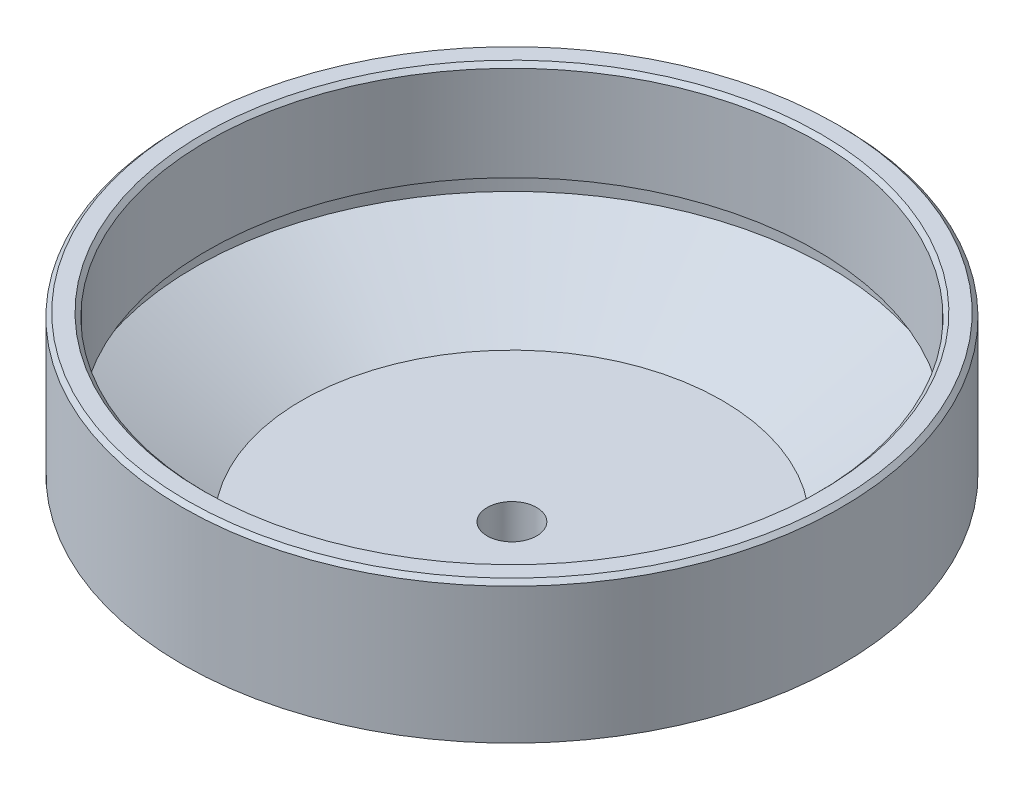
ISO-10303-21;
HEADER;
FILE_DESCRIPTION(('STEP AP214'),'2;1');
FILE_NAME('part.step','',(''),(''),'','','');
FILE_SCHEMA(('AUTOMOTIVE_DESIGN { 1 0 10303 214 1 1 1 1 }'));
ENDSEC;
DATA;
#1=APPLICATION_CONTEXT('core data for automotive mechanical design processes');
#2=APPLICATION_PROTOCOL_DEFINITION('international standard','automotive_design',2000,#1);
#3=PRODUCT_CONTEXT('',#1,'mechanical');
#4=PRODUCT('Part','Part','',(#3));
#5=PRODUCT_RELATED_PRODUCT_CATEGORY('part','',(#4));
#6=PRODUCT_DEFINITION_FORMATION('','',#4);
#7=PRODUCT_DEFINITION_CONTEXT('part definition',#1,'design');
#8=PRODUCT_DEFINITION('design','',#6,#7);
#9=PRODUCT_DEFINITION_SHAPE('','',#8);
#10=(LENGTH_UNIT() NAMED_UNIT(*) SI_UNIT(.MILLI.,.METRE.));
#11=(NAMED_UNIT(*) PLANE_ANGLE_UNIT() SI_UNIT($,.RADIAN.));
#12=(NAMED_UNIT(*) SI_UNIT($,.STERADIAN.) SOLID_ANGLE_UNIT());
#13=UNCERTAINTY_MEASURE_WITH_UNIT(LENGTH_MEASURE(1.E-05),#10,'distance_accuracy_value','');
#14=(GEOMETRIC_REPRESENTATION_CONTEXT(3) GLOBAL_UNCERTAINTY_ASSIGNED_CONTEXT((#13)) GLOBAL_UNIT_ASSIGNED_CONTEXT((#10,
#11,#12)) REPRESENTATION_CONTEXT('',''));
#15=CARTESIAN_POINT('',(0.,0.,0.));
#16=DIRECTION('',(0.,0.,1.));
#17=DIRECTION('',(1.,0.,0.));
#18=AXIS2_PLACEMENT_3D('',#15,#16,#17);
#19=CARTESIAN_POINT('',(37.,28.,-2.58369619074392E-13));
#20=DIRECTION('',(0.,1.,0.));
#21=DIRECTION('',(0.,0.,1.));
#22=AXIS2_PLACEMENT_3D('',#19,#20,#21);
#23=PLANE('',#22);
#24=CARTESIAN_POINT('',(0.,28.,0.));
#25=DIRECTION('',(0.,1.,0.));
#26=DIRECTION('',(0.,0.,1.));
#27=AXIS2_PLACEMENT_3D('',#24,#25,#26);
#28=CIRCLE('',#27,39.5);
#29=CARTESIAN_POINT('',(0.,28.,39.5));
#30=VERTEX_POINT('',#29);
#31=EDGE_CURVE('E46',#30,#30,#28,.T.);
#32=ORIENTED_EDGE('',*,*,#31,.T.);
#33=EDGE_LOOP('',(#32));
#34=FACE_BOUND('',#33,.T.);
#35=CARTESIAN_POINT('',(0.,28.,0.));
#36=DIRECTION('',(0.,1.,0.));
#37=DIRECTION('',(0.,0.,1.));
#38=AXIS2_PLACEMENT_3D('',#35,#36,#37);
#39=CIRCLE('',#38,37.5);
#40=CARTESIAN_POINT('',(0.,28.,37.5));
#41=VERTEX_POINT('',#40);
#42=EDGE_CURVE('E50',#41,#41,#39,.F.);
#43=ORIENTED_EDGE('',*,*,#42,.T.);
#44=EDGE_LOOP('',(#43));
#45=FACE_BOUND('',#44,.T.);
#46=ADVANCED_FACE('F35',(#34,#45),#23,.T.);
#47=CARTESIAN_POINT('',(0.,26.1689859870494,0.));
#48=DIRECTION('',(0.,1.,0.));
#49=DIRECTION('',(0.,0.,1.));
#50=AXIS2_PLACEMENT_3D('',#47,#48,#49);
#51=CYLINDRICAL_SURFACE('',#50,40.);
#52=CARTESIAN_POINT('',(0.,27.5,0.));
#53=DIRECTION('',(0.,1.,0.));
#54=DIRECTION('',(0.,0.,1.));
#55=AXIS2_PLACEMENT_3D('',#52,#53,#54);
#56=CIRCLE('',#55,40.);
#57=CARTESIAN_POINT('',(0.,27.5,40.));
#58=VERTEX_POINT('',#57);
#59=EDGE_CURVE('E42',#58,#58,#56,.F.);
#60=ORIENTED_EDGE('',*,*,#59,.T.);
#61=EDGE_LOOP('',(#60));
#62=FACE_BOUND('',#61,.T.);
#63=CARTESIAN_POINT('',(0.,11.,0.));
#64=DIRECTION('',(0.,1.,0.));
#65=DIRECTION('',(0.,0.,1.));
#66=AXIS2_PLACEMENT_3D('',#63,#64,#65);
#67=CIRCLE('',#66,40.);
#68=CARTESIAN_POINT('',(0.,11.,40.));
#69=VERTEX_POINT('',#68);
#70=EDGE_CURVE('E61',#69,#69,#67,.T.);
#71=ORIENTED_EDGE('',*,*,#70,.T.);
#72=EDGE_LOOP('',(#71));
#73=FACE_BOUND('',#72,.T.);
#74=ADVANCED_FACE('F100',(#62,#73),#51,.T.);
#75=CARTESIAN_POINT('',(0.,11.,0.));
#76=DIRECTION('',(0.,1.,0.));
#77=DIRECTION('',(0.,0.,1.));
#78=AXIS2_PLACEMENT_3D('',#75,#76,#77);
#79=CONICAL_SURFACE('',#78,40.,1.0471975511966);
#80=CARTESIAN_POINT('',(0.,0.,0.));
#81=DIRECTION('',(0.,1.,0.));
#82=DIRECTION('',(0.,0.,1.));
#83=AXIS2_PLACEMENT_3D('',#80,#81,#82);
#84=CIRCLE('',#83,20.9474411167422);
#85=CARTESIAN_POINT('',(0.,0.,20.9474411167422));
#86=VERTEX_POINT('',#85);
#87=EDGE_CURVE('E64',#86,#86,#84,.T.);
#88=ORIENTED_EDGE('',*,*,#87,.T.);
#89=EDGE_LOOP('',(#88));
#90=FACE_BOUND('',#89,.T.);
#91=ORIENTED_EDGE('',*,*,#70,.F.);
#92=EDGE_LOOP('',(#91));
#93=FACE_BOUND('',#92,.T.);
#94=ADVANCED_FACE('F106',(#90,#93),#79,.T.);
#95=CARTESIAN_POINT('',(20.9474411167422,0.,-1.46275199511242E-13));
#96=DIRECTION('',(0.,-1.,0.));
#97=DIRECTION('',(0.,0.,-1.));
#98=AXIS2_PLACEMENT_3D('',#95,#96,#97);
#99=PLANE('',#98);
#100=CARTESIAN_POINT('',(0.,0.,0.));
#101=DIRECTION('',(0.,-1.,0.));
#102=DIRECTION('',(0.,0.,-1.));
#103=AXIS2_PLACEMENT_3D('',#100,#101,#102);
#104=CIRCLE('',#103,3.5);
#105=CARTESIAN_POINT('',(0.,0.,-3.5));
#106=VERTEX_POINT('',#105);
#107=EDGE_CURVE('E58',#106,#106,#104,.F.);
#108=ORIENTED_EDGE('',*,*,#107,.T.);
#109=EDGE_LOOP('',(#108));
#110=FACE_BOUND('',#109,.T.);
#111=ORIENTED_EDGE('',*,*,#87,.F.);
#112=EDGE_LOOP('',(#111));
#113=FACE_BOUND('',#112,.T.);
#114=ADVANCED_FACE('F147',(#110,#113),#99,.T.);
#115=CARTESIAN_POINT('',(0.,26.1689859870494,0.));
#116=DIRECTION('',(0.,1.,0.));
#117=DIRECTION('',(0.,0.,1.));
#118=AXIS2_PLACEMENT_3D('',#115,#116,#117);
#119=CYLINDRICAL_SURFACE('',#118,3.);
#120=CARTESIAN_POINT('',(0.,0.499999999999997,0.));
#121=DIRECTION('',(0.,-1.,0.));
#122=DIRECTION('',(0.,0.,-1.));
#123=AXIS2_PLACEMENT_3D('',#120,#121,#122);
#124=CIRCLE('',#123,3.);
#125=CARTESIAN_POINT('',(0.,0.499999999999997,-3.));
#126=VERTEX_POINT('',#125);
#127=EDGE_CURVE('E55',#126,#126,#124,.T.);
#128=ORIENTED_EDGE('',*,*,#127,.T.);
#129=EDGE_LOOP('',(#128));
#130=FACE_BOUND('',#129,.T.);
#131=CARTESIAN_POINT('',(0.,6.,0.));
#132=DIRECTION('',(0.,1.,0.));
#133=DIRECTION('',(0.,0.,1.));
#134=AXIS2_PLACEMENT_3D('',#131,#132,#133);
#135=CIRCLE('',#134,3.);
#136=CARTESIAN_POINT('',(0.,6.,3.));
#137=VERTEX_POINT('',#136);
#138=EDGE_CURVE('E67',#137,#137,#135,.T.);
#139=ORIENTED_EDGE('',*,*,#138,.T.);
#140=EDGE_LOOP('',(#139));
#141=FACE_BOUND('',#140,.T.);
#142=ADVANCED_FACE('F142',(#130,#141),#119,.F.);
#143=CARTESIAN_POINT('',(3.,6.,0.));
#144=DIRECTION('',(0.,1.,0.));
#145=DIRECTION('',(0.,0.,1.));
#146=AXIS2_PLACEMENT_3D('',#143,#144,#145);
#147=PLANE('',#146);
#148=CARTESIAN_POINT('',(0.,6.,0.));
#149=DIRECTION('',(0.,1.,0.));
#150=DIRECTION('',(0.,0.,1.));
#151=AXIS2_PLACEMENT_3D('',#148,#149,#150);
#152=CIRCLE('',#151,25.5096189432333);
#153=CARTESIAN_POINT('',(0.,6.,25.5096189432333));
#154=VERTEX_POINT('',#153);
#155=EDGE_CURVE('E70',#154,#154,#152,.T.);
#156=ORIENTED_EDGE('',*,*,#155,.T.);
#157=EDGE_LOOP('',(#156));
#158=FACE_BOUND('',#157,.T.);
#159=ORIENTED_EDGE('',*,*,#138,.F.);
#160=EDGE_LOOP('',(#159));
#161=FACE_BOUND('',#160,.T.);
#162=ADVANCED_FACE('F146',(#158,#161),#147,.T.);
#163=CARTESIAN_POINT('',(0.,6.,0.));
#164=DIRECTION('',(0.,1.,0.));
#165=DIRECTION('',(0.,0.,1.));
#166=AXIS2_PLACEMENT_3D('',#163,#164,#165);
#167=CONICAL_SURFACE('',#166,25.5096189432333,1.0471975511966);
#168=CARTESIAN_POINT('',(0.,13.5,0.));
#169=DIRECTION('',(0.,1.,0.));
#170=DIRECTION('',(0.,0.,1.));
#171=AXIS2_PLACEMENT_3D('',#168,#169,#170);
#172=CIRCLE('',#171,38.5);
#173=CARTESIAN_POINT('',(0.,13.5,38.5));
#174=VERTEX_POINT('',#173);
#175=EDGE_CURVE('E73',#174,#174,#172,.T.);
#176=ORIENTED_EDGE('',*,*,#175,.T.);
#177=EDGE_LOOP('',(#176));
#178=FACE_BOUND('',#177,.T.);
#179=ORIENTED_EDGE('',*,*,#155,.F.);
#180=EDGE_LOOP('',(#179));
#181=FACE_BOUND('',#180,.T.);
#182=ADVANCED_FACE('F185',(#178,#181),#167,.F.);
#183=CARTESIAN_POINT('',(0.,26.1689859870494,0.));
#184=DIRECTION('',(0.,1.,0.));
#185=DIRECTION('',(0.,0.,1.));
#186=AXIS2_PLACEMENT_3D('',#183,#184,#185);
#187=CYLINDRICAL_SURFACE('',#186,38.5);
#188=CARTESIAN_POINT('',(0.,16.,0.));
#189=DIRECTION('',(0.,1.,0.));
#190=DIRECTION('',(0.,0.,1.));
#191=AXIS2_PLACEMENT_3D('',#188,#189,#190);
#192=CIRCLE('',#191,38.5);
#193=CARTESIAN_POINT('',(0.,16.,38.5));
#194=VERTEX_POINT('',#193);
#195=EDGE_CURVE('E76',#194,#194,#192,.T.);
#196=ORIENTED_EDGE('',*,*,#195,.T.);
#197=EDGE_LOOP('',(#196));
#198=FACE_BOUND('',#197,.T.);
#199=ORIENTED_EDGE('',*,*,#175,.F.);
#200=EDGE_LOOP('',(#199));
#201=FACE_BOUND('',#200,.T.);
#202=ADVANCED_FACE('F97',(#198,#201),#187,.F.);
#203=CARTESIAN_POINT('',(38.5,16.,-2.68844063090921E-13));
#204=DIRECTION('',(0.,-1.,0.));
#205=DIRECTION('',(0.,0.,-1.));
#206=AXIS2_PLACEMENT_3D('',#203,#204,#205);
#207=PLANE('',#206);
#208=CARTESIAN_POINT('',(0.,16.,0.));
#209=DIRECTION('',(0.,1.,0.));
#210=DIRECTION('',(0.,0.,1.));
#211=AXIS2_PLACEMENT_3D('',#208,#209,#210);
#212=CIRCLE('',#211,37.);
#213=CARTESIAN_POINT('',(0.,16.,37.));
#214=VERTEX_POINT('',#213);
#215=EDGE_CURVE('E79',#214,#214,#212,.T.);
#216=ORIENTED_EDGE('',*,*,#215,.T.);
#217=EDGE_LOOP('',(#216));
#218=FACE_BOUND('',#217,.T.);
#219=ORIENTED_EDGE('',*,*,#195,.F.);
#220=EDGE_LOOP('',(#219));
#221=FACE_BOUND('',#220,.T.);
#222=ADVANCED_FACE('F83',(#218,#221),#207,.T.);
#223=CARTESIAN_POINT('',(0.,26.1689859870494,0.));
#224=DIRECTION('',(0.,1.,0.));
#225=DIRECTION('',(0.,0.,1.));
#226=AXIS2_PLACEMENT_3D('',#223,#224,#225);
#227=CYLINDRICAL_SURFACE('',#226,37.);
#228=CARTESIAN_POINT('',(0.,27.5,0.));
#229=DIRECTION('',(0.,1.,0.));
#230=DIRECTION('',(0.,0.,1.));
#231=AXIS2_PLACEMENT_3D('',#228,#229,#230);
#232=CIRCLE('',#231,37.);
#233=CARTESIAN_POINT('',(0.,27.5,37.));
#234=VERTEX_POINT('',#233);
#235=EDGE_CURVE('E10',#234,#234,#232,.T.);
#236=ORIENTED_EDGE('',*,*,#235,.T.);
#237=EDGE_LOOP('',(#236));
#238=FACE_BOUND('',#237,.T.);
#239=ORIENTED_EDGE('',*,*,#215,.F.);
#240=EDGE_LOOP('',(#239));
#241=FACE_BOUND('',#240,.T.);
#242=ADVANCED_FACE('F86',(#238,#241),#227,.F.);
#243=CARTESIAN_POINT('',(0.,0.,0.));
#244=DIRECTION('',(0.,-1.,0.));
#245=DIRECTION('',(0.,0.,-1.));
#246=AXIS2_PLACEMENT_3D('',#243,#244,#245);
#247=CONICAL_SURFACE('',#246,3.5,0.785398163397458);
#248=ORIENTED_EDGE('',*,*,#127,.F.);
#249=EDGE_LOOP('',(#248));
#250=FACE_BOUND('',#249,.T.);
#251=ORIENTED_EDGE('',*,*,#107,.F.);
#252=EDGE_LOOP('',(#251));
#253=FACE_BOUND('',#252,.T.);
#254=ADVANCED_FACE('F88',(#250,#253),#247,.F.);
#255=CARTESIAN_POINT('',(0.,28.,0.));
#256=DIRECTION('',(0.,-1.,0.));
#257=DIRECTION('',(0.,0.,-1.));
#258=AXIS2_PLACEMENT_3D('',#255,#256,#257);
#259=CONICAL_SURFACE('',#258,39.5,0.785398163397462);
#260=ORIENTED_EDGE('',*,*,#59,.F.);
#261=EDGE_LOOP('',(#260));
#262=FACE_BOUND('',#261,.T.);
#263=ORIENTED_EDGE('',*,*,#31,.F.);
#264=EDGE_LOOP('',(#263));
#265=FACE_BOUND('',#264,.T.);
#266=ADVANCED_FACE('F94',(#262,#265),#259,.T.);
#267=CARTESIAN_POINT('',(0.,27.5,0.));
#268=DIRECTION('',(0.,1.,0.));
#269=DIRECTION('',(0.,0.,1.));
#270=AXIS2_PLACEMENT_3D('',#267,#268,#269);
#271=CONICAL_SURFACE('',#270,37.,0.785398163397455);
#272=ORIENTED_EDGE('',*,*,#42,.F.);
#273=EDGE_LOOP('',(#272));
#274=FACE_BOUND('',#273,.T.);
#275=ORIENTED_EDGE('',*,*,#235,.F.);
#276=EDGE_LOOP('',(#275));
#277=FACE_BOUND('',#276,.T.);
#278=ADVANCED_FACE('F37',(#274,#277),#271,.F.);
#279=CLOSED_SHELL('',(#46,#74,#94,#114,#142,#162,#182,#202,#222,#242,#254,#266,#278));
#280=MANIFOLD_SOLID_BREP('B2',#279);
#281=ADVANCED_BREP_SHAPE_REPRESENTATION('',(#18,#280),#14);
#282=SHAPE_DEFINITION_REPRESENTATION(#9,#281);
ENDSEC;
END-ISO-10303-21;
